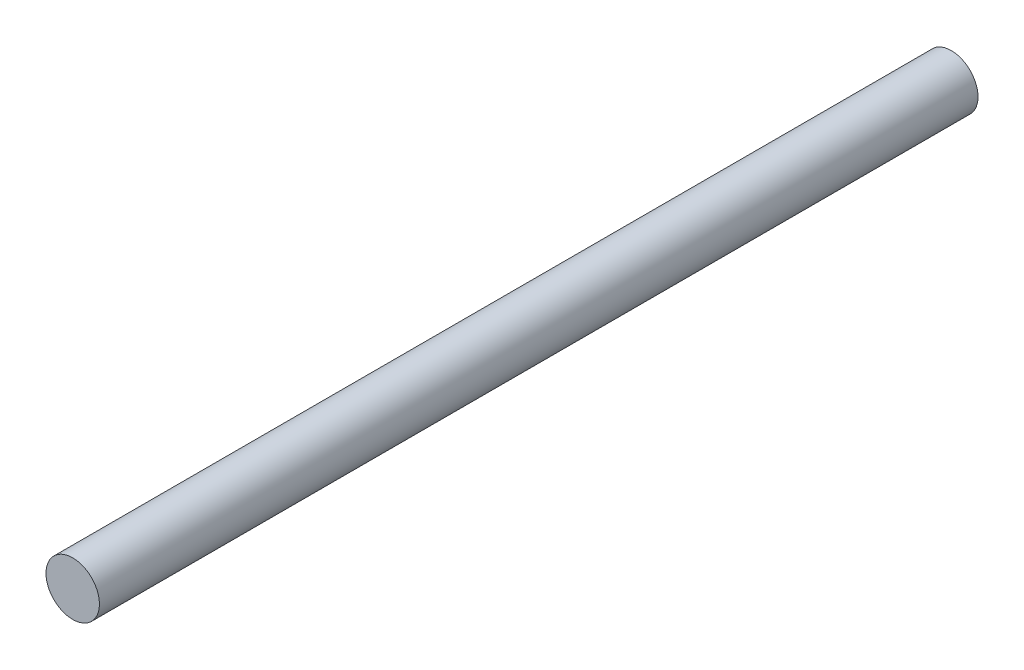
ISO-10303-21;
HEADER;
FILE_DESCRIPTION(('STEP AP214'),'2;1');
FILE_NAME('part.step','',(''),(''),'','','');
FILE_SCHEMA(('AUTOMOTIVE_DESIGN { 1 0 10303 214 1 1 1 1 }'));
ENDSEC;
DATA;
#1=APPLICATION_CONTEXT('core data for automotive mechanical design processes');
#2=APPLICATION_PROTOCOL_DEFINITION('international standard','automotive_design',2000,#1);
#3=PRODUCT_CONTEXT('',#1,'mechanical');
#4=PRODUCT('Part','Part','',(#3));
#5=PRODUCT_RELATED_PRODUCT_CATEGORY('part','',(#4));
#6=PRODUCT_DEFINITION_FORMATION('','',#4);
#7=PRODUCT_DEFINITION_CONTEXT('part definition',#1,'design');
#8=PRODUCT_DEFINITION('design','',#6,#7);
#9=PRODUCT_DEFINITION_SHAPE('','',#8);
#10=(LENGTH_UNIT() NAMED_UNIT(*) SI_UNIT(.MILLI.,.METRE.));
#11=(NAMED_UNIT(*) PLANE_ANGLE_UNIT() SI_UNIT($,.RADIAN.));
#12=(NAMED_UNIT(*) SI_UNIT($,.STERADIAN.) SOLID_ANGLE_UNIT());
#13=UNCERTAINTY_MEASURE_WITH_UNIT(LENGTH_MEASURE(1.E-05),#10,'distance_accuracy_value','');
#14=(GEOMETRIC_REPRESENTATION_CONTEXT(3) GLOBAL_UNCERTAINTY_ASSIGNED_CONTEXT((#13)) GLOBAL_UNIT_ASSIGNED_CONTEXT((#10,
#11,#12)) REPRESENTATION_CONTEXT('',''));
#15=CARTESIAN_POINT('',(0.,0.,0.));
#16=DIRECTION('',(0.,0.,1.));
#17=DIRECTION('',(1.,0.,0.));
#18=AXIS2_PLACEMENT_3D('',#15,#16,#17);
#19=CARTESIAN_POINT('',(0.,0.,-280.));
#20=DIRECTION('',(0.,0.,1.));
#21=DIRECTION('',(1.,0.,0.));
#22=AXIS2_PLACEMENT_3D('',#19,#20,#21);
#23=PLANE('',#22);
#24=CARTESIAN_POINT('',(0.,0.,-280.));
#25=DIRECTION('',(0.,0.,1.));
#26=DIRECTION('',(1.,0.,0.));
#27=AXIS2_PLACEMENT_3D('',#24,#25,#26);
#28=CIRCLE('',#27,22.5);
#29=CARTESIAN_POINT('',(22.5,0.,-280.));
#30=VERTEX_POINT('',#29);
#31=EDGE_CURVE('E10',#30,#30,#28,.T.);
#32=ORIENTED_EDGE('',*,*,#31,.F.);
#33=EDGE_LOOP('',(#32));
#34=FACE_BOUND('',#33,.T.);
#35=ADVANCED_FACE('F32',(#34),#23,.F.);
#36=CARTESIAN_POINT('',(0.,0.,535.001));
#37=DIRECTION('',(0.,0.,-1.));
#38=DIRECTION('',(-1.,0.,0.));
#39=AXIS2_PLACEMENT_3D('',#36,#37,#38);
#40=CYLINDRICAL_SURFACE('',#39,22.5);
#41=CARTESIAN_POINT('',(0.,0.,460.));
#42=DIRECTION('',(0.,0.,-1.));
#43=DIRECTION('',(-1.,0.,0.));
#44=AXIS2_PLACEMENT_3D('',#41,#42,#43);
#45=CIRCLE('',#44,22.5);
#46=CARTESIAN_POINT('',(-22.5,0.,460.));
#47=VERTEX_POINT('',#46);
#48=EDGE_CURVE('E36',#47,#47,#45,.T.);
#49=ORIENTED_EDGE('',*,*,#48,.T.);
#50=EDGE_LOOP('',(#49));
#51=FACE_BOUND('',#50,.T.);
#52=ORIENTED_EDGE('',*,*,#31,.T.);
#53=EDGE_LOOP('',(#52));
#54=FACE_BOUND('',#53,.T.);
#55=ADVANCED_FACE('F34',(#51,#54),#40,.T.);
#56=CARTESIAN_POINT('',(-95.1405526323362,-25.,460.));
#57=DIRECTION('',(0.,0.,-1.));
#58=DIRECTION('',(-1.,0.,0.));
#59=AXIS2_PLACEMENT_3D('',#56,#57,#58);
#60=PLANE('',#59);
#61=ORIENTED_EDGE('',*,*,#48,.F.);
#62=EDGE_LOOP('',(#61));
#63=FACE_BOUND('',#62,.T.);
#64=ADVANCED_FACE('F46',(#63),#60,.F.);
#65=CLOSED_SHELL('',(#35,#55,#64));
#66=MANIFOLD_SOLID_BREP('B2',#65);
#67=ADVANCED_BREP_SHAPE_REPRESENTATION('',(#18,#66),#14);
#68=SHAPE_DEFINITION_REPRESENTATION(#9,#67);
ENDSEC;
END-ISO-10303-21;
